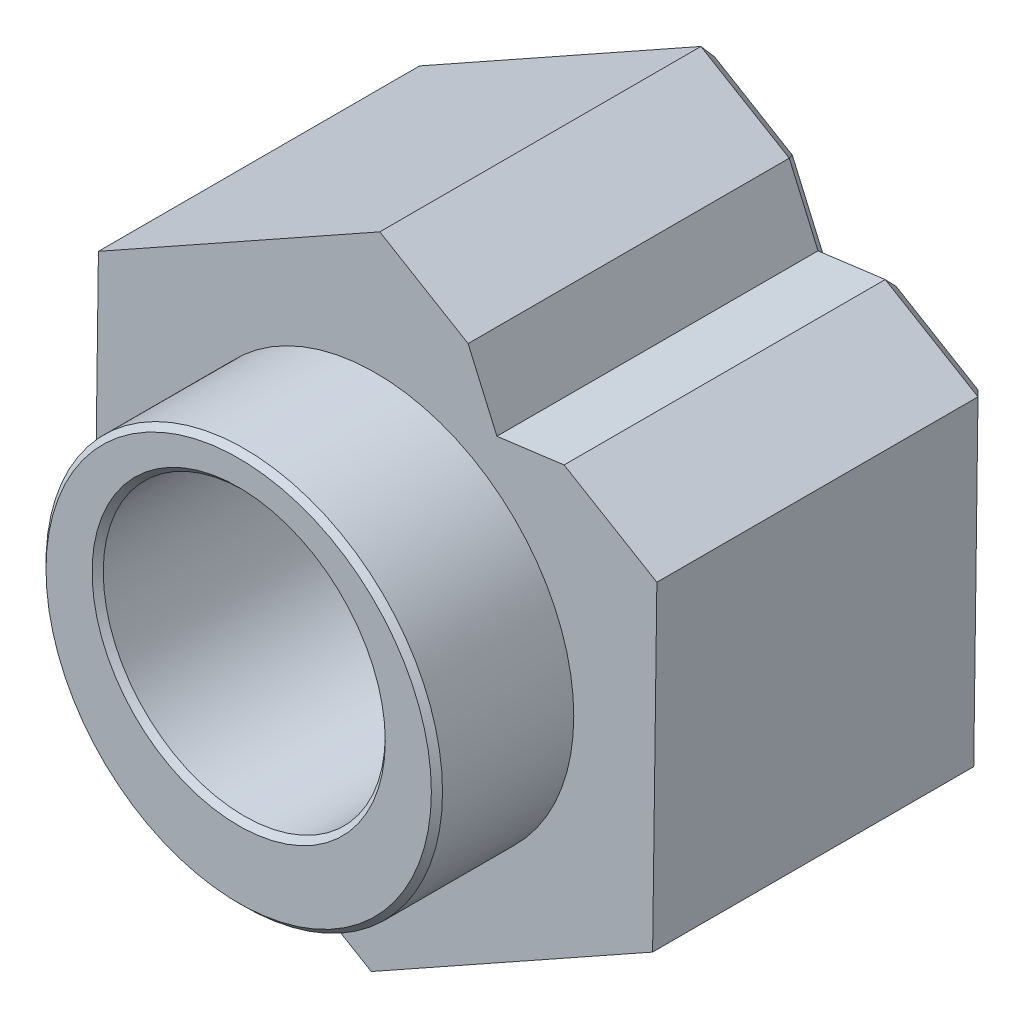
ISO-10303-21;
HEADER;
FILE_DESCRIPTION(('STEP AP214'),'2;1');
FILE_NAME('part.step','',(''),(''),'','','');
FILE_SCHEMA(('AUTOMOTIVE_DESIGN { 1 0 10303 214 1 1 1 1 }'));
ENDSEC;
DATA;
#1=APPLICATION_CONTEXT('core data for automotive mechanical design processes');
#2=APPLICATION_PROTOCOL_DEFINITION('international standard','automotive_design',2000,#1);
#3=PRODUCT_CONTEXT('',#1,'mechanical');
#4=PRODUCT('Part','Part','',(#3));
#5=PRODUCT_RELATED_PRODUCT_CATEGORY('part','',(#4));
#6=PRODUCT_DEFINITION_FORMATION('','',#4);
#7=PRODUCT_DEFINITION_CONTEXT('part definition',#1,'design');
#8=PRODUCT_DEFINITION('design','',#6,#7);
#9=PRODUCT_DEFINITION_SHAPE('','',#8);
#10=(LENGTH_UNIT() NAMED_UNIT(*) SI_UNIT(.MILLI.,.METRE.));
#11=(NAMED_UNIT(*) PLANE_ANGLE_UNIT() SI_UNIT($,.RADIAN.));
#12=(NAMED_UNIT(*) SI_UNIT($,.STERADIAN.) SOLID_ANGLE_UNIT());
#13=UNCERTAINTY_MEASURE_WITH_UNIT(LENGTH_MEASURE(1.E-05),#10,'distance_accuracy_value','');
#14=(GEOMETRIC_REPRESENTATION_CONTEXT(3) GLOBAL_UNCERTAINTY_ASSIGNED_CONTEXT((#13)) GLOBAL_UNIT_ASSIGNED_CONTEXT((#10,
#11,#12)) REPRESENTATION_CONTEXT('',''));
#15=CARTESIAN_POINT('',(0.,0.,0.));
#16=DIRECTION('',(0.,0.,1.));
#17=DIRECTION('',(1.,0.,0.));
#18=AXIS2_PLACEMENT_3D('',#15,#16,#17);
#19=CARTESIAN_POINT('',(5.03768639421828,2.82046966422999,6.));
#20=DIRECTION('',(-0.511393121150085,-0.859346889003721,0.));
#21=DIRECTION('',(0.859346889003721,-0.511393121150085,0.));
#22=AXIS2_PLACEMENT_3D('',#19,#20,#21);
#23=PLANE('',#22);
#24=DIRECTION('',(0.,0.,-1.));
#25=VECTOR('',#24,1.);
#26=CARTESIAN_POINT('',(1.65800995994404,4.83169854318089,8.45));
#27=LINE('',#26,#25);
#28=CARTESIAN_POINT('',(1.65800995994404,4.83169854318089,6.));
#29=VERTEX_POINT('',#28);
#30=CARTESIAN_POINT('',(1.65800995994404,4.83169854318089,0.250000000000004));
#31=VERTEX_POINT('',#30);
#32=EDGE_CURVE('E142',#29,#31,#27,.T.);
#33=ORIENTED_EDGE('',*,*,#32,.T.);
#34=DIRECTION('',(-0.859346889003721,0.511393121150085,0.));
#35=VECTOR('',#34,1.);
#36=CARTESIAN_POINT('',(5.03768639421828,2.82046966422999,0.250000000000004));
#37=LINE('',#36,#35);
#38=CARTESIAN_POINT('',(0.0762448172825978,5.77299922580725,0.250000000000004));
#39=VERTEX_POINT('',#38);
#40=EDGE_CURVE('E223',#31,#39,#37,.T.);
#41=ORIENTED_EDGE('',*,*,#40,.T.);
#42=DIRECTION('',(0.,0.,-1.));
#43=VECTOR('',#42,1.);
#44=CARTESIAN_POINT('',(0.0762448172825978,5.77299922580725,6.));
#45=LINE('',#44,#43);
#46=CARTESIAN_POINT('',(0.0762448172825978,5.77299922580725,6.));
#47=VERTEX_POINT('',#46);
#48=EDGE_CURVE('E178',#47,#39,#45,.T.);
#49=ORIENTED_EDGE('',*,*,#48,.F.);
#50=DIRECTION('',(-0.859346889003721,0.511393121150085,0.));
#51=VECTOR('',#50,1.);
#52=CARTESIAN_POINT('',(5.03768639421828,2.82046966422999,6.));
#53=LINE('',#52,#51);
#54=EDGE_CURVE('E159',#29,#47,#53,.T.);
#55=ORIENTED_EDGE('',*,*,#54,.F.);
#56=EDGE_LOOP('',(#33,#41,#49,#55));
#57=FACE_BOUND('',#56,.T.);
#58=ADVANCED_FACE('F34',(#57),#23,.F.);
#59=CARTESIAN_POINT('',(-0.0762448172825973,-5.77299922580725,6.));
#60=DIRECTION('',(-0.488519675965306,0.872552878738448,0.));
#61=DIRECTION('',(-0.872552878738448,-0.488519675965306,0.));
#62=AXIS2_PLACEMENT_3D('',#59,#60,#61);
#63=PLANE('',#62);
#64=DIRECTION('',(0.,0.,-1.));
#65=VECTOR('',#64,1.);
#66=CARTESIAN_POINT('',(-0.0762448172825973,-5.77299922580725,6.));
#67=LINE('',#66,#65);
#68=CARTESIAN_POINT('',(-0.0762448172825973,-5.77299922580725,6.));
#69=VERTEX_POINT('',#68);
#70=CARTESIAN_POINT('',(-0.0762448172825973,-5.77299922580725,0.250000000000004));
#71=VERTEX_POINT('',#70);
#72=EDGE_CURVE('E169',#69,#71,#67,.T.);
#73=ORIENTED_EDGE('',*,*,#72,.T.);
#74=DIRECTION('',(0.872552878738448,0.488519675965306,0.));
#75=VECTOR('',#74,1.);
#76=CARTESIAN_POINT('',(-0.0762448172825973,-5.77299922580725,0.250000000000004));
#77=LINE('',#76,#75);
#78=CARTESIAN_POINT('',(4.96144157693568,-2.95252956157726,0.250000000000004));
#79=VERTEX_POINT('',#78);
#80=EDGE_CURVE('E216',#71,#79,#77,.T.);
#81=ORIENTED_EDGE('',*,*,#80,.T.);
#82=DIRECTION('',(0.,0.,-1.));
#83=VECTOR('',#82,1.);
#84=CARTESIAN_POINT('',(4.96144157693568,-2.95252956157726,6.));
#85=LINE('',#84,#83);
#86=CARTESIAN_POINT('',(4.96144157693568,-2.95252956157726,6.));
#87=VERTEX_POINT('',#86);
#88=EDGE_CURVE('E183',#87,#79,#85,.T.);
#89=ORIENTED_EDGE('',*,*,#88,.F.);
#90=DIRECTION('',(0.872552878738448,0.488519675965306,0.));
#91=VECTOR('',#90,1.);
#92=CARTESIAN_POINT('',(-0.0762448172825973,-5.77299922580725,6.));
#93=LINE('',#92,#91);
#94=EDGE_CURVE('E369',#69,#87,#93,.T.);
#95=ORIENTED_EDGE('',*,*,#94,.F.);
#96=EDGE_LOOP('',(#73,#81,#89,#95));
#97=FACE_BOUND('',#96,.T.);
#98=ADVANCED_FACE('F300',(#97),#63,.F.);
#99=CARTESIAN_POINT('',(4.96144157693568,-2.95252956157726,6.));
#100=DIRECTION('',(-0.999912797115391,0.0132059897347263,0.));
#101=DIRECTION('',(-0.0132059897347263,-0.999912797115392,0.));
#102=AXIS2_PLACEMENT_3D('',#99,#100,#101);
#103=PLANE('',#102);
#104=ORIENTED_EDGE('',*,*,#88,.T.);
#105=DIRECTION('',(0.0132059897347263,0.999912797115392,0.));
#106=VECTOR('',#105,1.);
#107=CARTESIAN_POINT('',(4.96144157693568,-2.95252956157726,0.250000000000004));
#108=LINE('',#107,#106);
#109=CARTESIAN_POINT('',(5.03768639421828,2.82046966422999,0.250000000000004));
#110=VERTEX_POINT('',#109);
#111=EDGE_CURVE('E218',#79,#110,#108,.T.);
#112=ORIENTED_EDGE('',*,*,#111,.T.);
#113=DIRECTION('',(0.,0.,-1.));
#114=VECTOR('',#113,1.);
#115=CARTESIAN_POINT('',(5.03768639421828,2.82046966422999,6.));
#116=LINE('',#115,#114);
#117=CARTESIAN_POINT('',(5.03768639421828,2.82046966422999,6.));
#118=VERTEX_POINT('',#117);
#119=EDGE_CURVE('E181',#118,#110,#116,.T.);
#120=ORIENTED_EDGE('',*,*,#119,.F.);
#121=DIRECTION('',(0.0132059897347263,0.999912797115392,0.));
#122=VECTOR('',#121,1.);
#123=CARTESIAN_POINT('',(4.96144157693568,-2.95252956157726,6.));
#124=LINE('',#123,#122);
#125=EDGE_CURVE('E156',#87,#118,#124,.T.);
#126=ORIENTED_EDGE('',*,*,#125,.F.);
#127=EDGE_LOOP('',(#104,#112,#120,#126));
#128=FACE_BOUND('',#127,.T.);
#129=ADVANCED_FACE('F306',(#128),#103,.F.);
#130=ORIENTED_EDGE('',*,*,#119,.T.);
#131=DIRECTION('',(-0.859346889003721,0.511393121150085,0.));
#132=VECTOR('',#131,1.);
#133=CARTESIAN_POINT('',(5.03768639421828,2.82046966422999,0.250000000000004));
#134=LINE('',#133,#132);
#135=CARTESIAN_POINT('',(3.37670373795148,3.80891230088072,0.250000000000004));
#136=VERTEX_POINT('',#135);
#137=EDGE_CURVE('E150',#110,#136,#134,.T.);
#138=ORIENTED_EDGE('',*,*,#137,.T.);
#139=DIRECTION('',(0.,0.,-1.));
#140=VECTOR('',#139,1.);
#141=CARTESIAN_POINT('',(3.37670373795148,3.80891230088072,8.45));
#142=LINE('',#141,#140);
#143=CARTESIAN_POINT('',(3.37670373795148,3.80891230088072,6.));
#144=VERTEX_POINT('',#143);
#145=EDGE_CURVE('E135',#144,#136,#142,.T.);
#146=ORIENTED_EDGE('',*,*,#145,.F.);
#147=EDGE_CURVE('E148',#118,#144,#53,.T.);
#148=ORIENTED_EDGE('',*,*,#147,.F.);
#149=EDGE_LOOP('',(#130,#138,#146,#148));
#150=FACE_BOUND('',#149,.T.);
#151=ADVANCED_FACE('F147',(#150),#23,.F.);
#152=CARTESIAN_POINT('',(0.0762448172825978,5.77299922580725,6.));
#153=DIRECTION('',(0.488519675965306,-0.872552878738448,0.));
#154=DIRECTION('',(0.872552878738448,0.488519675965306,0.));
#155=AXIS2_PLACEMENT_3D('',#152,#153,#154);
#156=PLANE('',#155);
#157=ORIENTED_EDGE('',*,*,#48,.T.);
#158=DIRECTION('',(-0.872552878738448,-0.488519675965306,0.));
#159=VECTOR('',#158,1.);
#160=CARTESIAN_POINT('',(0.0762448172825978,5.77299922580725,0.250000000000004));
#161=LINE('',#160,#159);
#162=CARTESIAN_POINT('',(-4.96144157693568,2.95252956157726,0.250000000000004));
#163=VERTEX_POINT('',#162);
#164=EDGE_CURVE('E187',#39,#163,#161,.T.);
#165=ORIENTED_EDGE('',*,*,#164,.T.);
#166=DIRECTION('',(0.,0.,-1.));
#167=VECTOR('',#166,1.);
#168=CARTESIAN_POINT('',(-4.96144157693568,2.95252956157726,6.));
#169=LINE('',#168,#167);
#170=CARTESIAN_POINT('',(-4.96144157693568,2.95252956157726,6.));
#171=VERTEX_POINT('',#170);
#172=EDGE_CURVE('E175',#171,#163,#169,.T.);
#173=ORIENTED_EDGE('',*,*,#172,.F.);
#174=DIRECTION('',(-0.872552878738448,-0.488519675965306,0.));
#175=VECTOR('',#174,1.);
#176=CARTESIAN_POINT('',(0.0762448172825978,5.77299922580725,6.));
#177=LINE('',#176,#175);
#178=EDGE_CURVE('E158',#47,#171,#177,.T.);
#179=ORIENTED_EDGE('',*,*,#178,.F.);
#180=EDGE_LOOP('',(#157,#165,#173,#179));
#181=FACE_BOUND('',#180,.T.);
#182=ADVANCED_FACE('F312',(#181),#156,.F.);
#183=CARTESIAN_POINT('',(-4.96144157693568,2.95252956157726,6.));
#184=DIRECTION('',(0.999912797115391,-0.0132059897347262,0.));
#185=DIRECTION('',(0.0132059897347262,0.999912797115392,0.));
#186=AXIS2_PLACEMENT_3D('',#183,#184,#185);
#187=PLANE('',#186);
#188=ORIENTED_EDGE('',*,*,#172,.T.);
#189=DIRECTION('',(-0.0132059897347262,-0.999912797115392,0.));
#190=VECTOR('',#189,1.);
#191=CARTESIAN_POINT('',(-4.96144157693568,2.95252956157726,0.250000000000004));
#192=LINE('',#191,#190);
#193=CARTESIAN_POINT('',(-5.03768639421827,-2.82046966422999,0.250000000000004));
#194=VERTEX_POINT('',#193);
#195=EDGE_CURVE('E212',#163,#194,#192,.T.);
#196=ORIENTED_EDGE('',*,*,#195,.T.);
#197=DIRECTION('',(0.,0.,-1.));
#198=VECTOR('',#197,1.);
#199=CARTESIAN_POINT('',(-5.03768639421827,-2.82046966422999,6.));
#200=LINE('',#199,#198);
#201=CARTESIAN_POINT('',(-5.03768639421827,-2.82046966422999,6.));
#202=VERTEX_POINT('',#201);
#203=EDGE_CURVE('E172',#202,#194,#200,.T.);
#204=ORIENTED_EDGE('',*,*,#203,.F.);
#205=DIRECTION('',(-0.0132059897347262,-0.999912797115392,0.));
#206=VECTOR('',#205,1.);
#207=CARTESIAN_POINT('',(-4.96144157693568,2.95252956157726,6.));
#208=LINE('',#207,#206);
#209=EDGE_CURVE('E161',#171,#202,#208,.T.);
#210=ORIENTED_EDGE('',*,*,#209,.F.);
#211=EDGE_LOOP('',(#188,#196,#204,#210));
#212=FACE_BOUND('',#211,.T.);
#213=ADVANCED_FACE('F317',(#212),#187,.F.);
#214=CARTESIAN_POINT('',(-5.03768639421827,-2.82046966422999,6.));
#215=DIRECTION('',(0.511393121150085,0.859346889003721,0.));
#216=DIRECTION('',(-0.859346889003721,0.511393121150085,0.));
#217=AXIS2_PLACEMENT_3D('',#214,#215,#216);
#218=PLANE('',#217);
#219=ORIENTED_EDGE('',*,*,#203,.T.);
#220=DIRECTION('',(0.859346889003721,-0.511393121150085,0.));
#221=VECTOR('',#220,1.);
#222=CARTESIAN_POINT('',(-5.03768639421827,-2.82046966422999,0.250000000000004));
#223=LINE('',#222,#221);
#224=EDGE_CURVE('E214',#194,#71,#223,.T.);
#225=ORIENTED_EDGE('',*,*,#224,.T.);
#226=ORIENTED_EDGE('',*,*,#72,.F.);
#227=DIRECTION('',(0.859346889003721,-0.511393121150085,0.));
#228=VECTOR('',#227,1.);
#229=CARTESIAN_POINT('',(-5.03768639421827,-2.82046966422999,6.));
#230=LINE('',#229,#228);
#231=EDGE_CURVE('E167',#202,#69,#230,.T.);
#232=ORIENTED_EDGE('',*,*,#231,.F.);
#233=EDGE_LOOP('',(#219,#225,#226,#232));
#234=FACE_BOUND('',#233,.T.);
#235=ADVANCED_FACE('F376',(#234),#218,.F.);
#236=CARTESIAN_POINT('',(0.,0.,6.));
#237=DIRECTION('',(0.,0.,1.));
#238=DIRECTION('',(1.,0.,0.));
#239=AXIS2_PLACEMENT_3D('',#236,#237,#238);
#240=PLANE('',#239);
#241=DIRECTION('',(0.400421555458872,-0.916331041667747,0.));
#242=VECTOR('',#241,1.);
#243=CARTESIAN_POINT('',(3.16500947037353,1.38305694944312,6.));
#244=LINE('',#243,#242);
#245=CARTESIAN_POINT('',(2.17342076488787,3.65222427826583,6.));
#246=VERTEX_POINT('',#245);
#247=EDGE_CURVE('E141',#29,#246,#244,.T.);
#248=ORIENTED_EDGE('',*,*,#247,.F.);
#249=ORIENTED_EDGE('',*,*,#54,.T.);
#250=ORIENTED_EDGE('',*,*,#178,.T.);
#251=ORIENTED_EDGE('',*,*,#209,.T.);
#252=ORIENTED_EDGE('',*,*,#231,.T.);
#253=ORIENTED_EDGE('',*,*,#94,.T.);
#254=ORIENTED_EDGE('',*,*,#125,.T.);
#255=ORIENTED_EDGE('',*,*,#147,.T.);
#256=DIRECTION('',(0.991628072784241,0.129126934704627,0.));
#257=VECTOR('',#256,1.);
#258=CARTESIAN_POINT('',(-0.431413212970031,3.31303034436393,6.));
#259=LINE('',#258,#257);
#260=EDGE_CURVE('E132',#246,#144,#259,.T.);
#261=ORIENTED_EDGE('',*,*,#260,.F.);
#262=EDGE_LOOP('',(#248,#249,#250,#251,#252,#253,#254,#255,#261));
#263=FACE_BOUND('',#262,.T.);
#264=CARTESIAN_POINT('',(0.,0.,6.));
#265=DIRECTION('',(0.,0.,1.));
#266=DIRECTION('',(1.,0.,0.));
#267=AXIS2_PLACEMENT_3D('',#264,#265,#266);
#268=CIRCLE('',#267,3.55);
#269=CARTESIAN_POINT('',(3.55,0.,6.));
#270=VERTEX_POINT('',#269);
#271=EDGE_CURVE('E186',#270,#270,#268,.T.);
#272=ORIENTED_EDGE('',*,*,#271,.F.);
#273=EDGE_LOOP('',(#272));
#274=FACE_BOUND('',#273,.T.);
#275=ADVANCED_FACE('F153',(#263,#274),#240,.T.);
#276=CARTESIAN_POINT('',(0.,0.,0.));
#277=DIRECTION('',(0.,0.,1.));
#278=DIRECTION('',(1.,0.,0.));
#279=AXIS2_PLACEMENT_3D('',#276,#277,#278);
#280=PLANE('',#279);
#281=DIRECTION('',(0.0132059897347262,0.999912797115392,0.));
#282=VECTOR('',#281,1.);
#283=CARTESIAN_POINT('',(-4.74958578629813,0.0627284512399496,0.));
#284=LINE('',#283,#282);
#285=CARTESIAN_POINT('',(-4.78580207450736,-2.67944618101849,0.));
#286=VERTEX_POINT('',#285);
#287=CARTESIAN_POINT('',(-4.71336949808889,2.80490308349839,0.));
#288=VERTEX_POINT('',#287);
#289=EDGE_CURVE('E207',#286,#288,#284,.T.);
#290=ORIENTED_EDGE('',*,*,#289,.T.);
#291=DIRECTION('',(0.872552878738448,0.488519675965306,0.));
#292=VECTOR('',#291,1.);
#293=CARTESIAN_POINT('',(-2.32046846083521,4.14462617400764,0.));
#294=LINE('',#293,#292);
#295=CARTESIAN_POINT('',(0.0724325764184689,5.48434926451689,0.));
#296=VERTEX_POINT('',#295);
#297=EDGE_CURVE('E209',#288,#296,#294,.T.);
#298=ORIENTED_EDGE('',*,*,#297,.T.);
#299=DIRECTION('',(0.859346889003721,-0.511393121150085,0.));
#300=VECTOR('',#299,1.);
#301=CARTESIAN_POINT('',(2.42911732546291,4.08189772276769,0.));
#302=LINE('',#301,#300);
#303=CARTESIAN_POINT('',(1.4611049129614,4.65795716427575,0.));
#304=VERTEX_POINT('',#303);
#305=EDGE_CURVE('E193',#296,#304,#302,.T.);
#306=ORIENTED_EDGE('',*,*,#305,.T.);
#307=DIRECTION('',(0.400421555458872,-0.916331041667747,0.));
#308=VECTOR('',#307,1.);
#309=CARTESIAN_POINT('',(2.93592670995659,1.2829515605784,0.));
#310=LINE('',#309,#308);
#311=CARTESIAN_POINT('',(2.01951921578921,3.38007301239488,0.));
#312=VERTEX_POINT('',#311);
#313=EDGE_CURVE('E195',#304,#312,#310,.T.);
#314=ORIENTED_EDGE('',*,*,#313,.T.);
#315=DIRECTION('',(0.991628072784241,0.129126934704627,0.));
#316=VECTOR('',#315,1.);
#317=CARTESIAN_POINT('',(-0.399131479293873,3.06512332616786,0.));
#318=LINE('',#317,#316);
#319=CARTESIAN_POINT('',(3.32319856450041,3.54983436017938,0.));
#320=VERTEX_POINT('',#319);
#321=EDGE_CURVE('E197',#312,#320,#318,.T.);
#322=ORIENTED_EDGE('',*,*,#321,.T.);
#323=DIRECTION('',(0.859346889003721,-0.511393121150085,0.));
#324=VECTOR('',#323,1.);
#325=CARTESIAN_POINT('',(2.42911732546291,4.08189772276769,0.));
#326=LINE('',#325,#324);
#327=CARTESIAN_POINT('',(4.78580207450736,2.67944618101849,0.));
#328=VERTEX_POINT('',#327);
#329=EDGE_CURVE('E199',#320,#328,#326,.T.);
#330=ORIENTED_EDGE('',*,*,#329,.T.);
#331=DIRECTION('',(-0.0132059897347263,-0.999912797115392,0.));
#332=VECTOR('',#331,1.);
#333=CARTESIAN_POINT('',(4.74958578629813,-0.0627284512399503,0.));
#334=LINE('',#333,#332);
#335=CARTESIAN_POINT('',(4.71336949808889,-2.80490308349839,0.));
#336=VERTEX_POINT('',#335);
#337=EDGE_CURVE('E201',#328,#336,#334,.T.);
#338=ORIENTED_EDGE('',*,*,#337,.T.);
#339=DIRECTION('',(-0.872552878738448,-0.488519675965306,0.));
#340=VECTOR('',#339,1.);
#341=CARTESIAN_POINT('',(2.32046846083521,-4.14462617400764,0.));
#342=LINE('',#341,#340);
#343=CARTESIAN_POINT('',(-0.0724325764184675,-5.48434926451689,0.));
#344=VERTEX_POINT('',#343);
#345=EDGE_CURVE('E203',#336,#344,#342,.T.);
#346=ORIENTED_EDGE('',*,*,#345,.T.);
#347=DIRECTION('',(-0.859346889003721,0.511393121150085,0.));
#348=VECTOR('',#347,1.);
#349=CARTESIAN_POINT('',(-2.42911732546291,-4.08189772276769,0.));
#350=LINE('',#349,#348);
#351=EDGE_CURVE('E205',#344,#286,#350,.T.);
#352=ORIENTED_EDGE('',*,*,#351,.T.);
#353=EDGE_LOOP('',(#290,#298,#306,#314,#322,#330,#338,#346,#352));
#354=FACE_BOUND('',#353,.T.);
#355=CARTESIAN_POINT('',(0.,0.375,0.));
#356=DIRECTION('',(0.,0.,1.));
#357=DIRECTION('',(1.,0.,0.));
#358=AXIS2_PLACEMENT_3D('',#355,#356,#357);
#359=CIRCLE('',#358,2.775);
#360=CARTESIAN_POINT('',(2.775,0.375,0.));
#361=VERTEX_POINT('',#360);
#362=EDGE_CURVE('E190',#361,#361,#359,.T.);
#363=ORIENTED_EDGE('',*,*,#362,.T.);
#364=EDGE_LOOP('',(#363));
#365=FACE_BOUND('',#364,.T.);
#366=ADVANCED_FACE('F375',(#354,#365),#280,.F.);
#367=CARTESIAN_POINT('',(0.,0.,8.45));
#368=DIRECTION('',(0.,0.,-1.));
#369=DIRECTION('',(-1.,0.,0.));
#370=AXIS2_PLACEMENT_3D('',#367,#368,#369);
#371=CYLINDRICAL_SURFACE('',#370,3.55);
#372=CARTESIAN_POINT('',(0.,0.,8.35));
#373=DIRECTION('',(0.,0.,1.));
#374=DIRECTION('',(1.,0.,0.));
#375=AXIS2_PLACEMENT_3D('',#372,#373,#374);
#376=CIRCLE('',#375,3.55);
#377=CARTESIAN_POINT('',(3.55,0.,8.35));
#378=VERTEX_POINT('',#377);
#379=EDGE_CURVE('E42',#378,#378,#376,.F.);
#380=ORIENTED_EDGE('',*,*,#379,.T.);
#381=EDGE_LOOP('',(#380));
#382=FACE_BOUND('',#381,.T.);
#383=ORIENTED_EDGE('',*,*,#271,.T.);
#384=EDGE_LOOP('',(#383));
#385=FACE_BOUND('',#384,.T.);
#386=ADVANCED_FACE('F260',(#382,#385),#371,.T.);
#387=CARTESIAN_POINT('',(0.,0.,8.45));
#388=DIRECTION('',(0.,0.,1.));
#389=DIRECTION('',(1.,0.,0.));
#390=AXIS2_PLACEMENT_3D('',#387,#388,#389);
#391=PLANE('',#390);
#392=CARTESIAN_POINT('',(0.,0.,8.45));
#393=DIRECTION('',(0.,0.,1.));
#394=DIRECTION('',(1.,0.,0.));
#395=AXIS2_PLACEMENT_3D('',#392,#393,#394);
#396=CIRCLE('',#395,3.45);
#397=CARTESIAN_POINT('',(3.45,0.,8.45));
#398=VERTEX_POINT('',#397);
#399=EDGE_CURVE('E255',#398,#398,#396,.T.);
#400=ORIENTED_EDGE('',*,*,#399,.T.);
#401=EDGE_LOOP('',(#400));
#402=FACE_BOUND('',#401,.T.);
#403=CARTESIAN_POINT('',(0.,0.375,8.45));
#404=DIRECTION('',(0.,0.,1.));
#405=DIRECTION('',(1.,0.,0.));
#406=AXIS2_PLACEMENT_3D('',#403,#404,#405);
#407=CIRCLE('',#406,2.625);
#408=CARTESIAN_POINT('',(2.625,0.375,8.45));
#409=VERTEX_POINT('',#408);
#410=EDGE_CURVE('E228',#409,#409,#407,.F.);
#411=ORIENTED_EDGE('',*,*,#410,.T.);
#412=EDGE_LOOP('',(#411));
#413=FACE_BOUND('',#412,.T.);
#414=ADVANCED_FACE('F269',(#402,#413),#391,.T.);
#415=CARTESIAN_POINT('',(1.65800995994404,4.83169854318089,8.45));
#416=DIRECTION('',(-0.916331041667747,-0.400421555458872,0.));
#417=DIRECTION('',(0.400421555458872,-0.916331041667747,0.));
#418=AXIS2_PLACEMENT_3D('',#415,#416,#417);
#419=PLANE('',#418);
#420=DIRECTION('',(0.,0.,-1.));
#421=VECTOR('',#420,1.);
#422=CARTESIAN_POINT('',(2.17342076488787,3.65222427826583,8.45));
#423=LINE('',#422,#421);
#424=CARTESIAN_POINT('',(2.17342076488787,3.65222427826583,0.250000000000004));
#425=VERTEX_POINT('',#424);
#426=EDGE_CURVE('E137',#246,#425,#423,.T.);
#427=ORIENTED_EDGE('',*,*,#426,.T.);
#428=DIRECTION('',(-0.400421555458872,0.916331041667747,0.));
#429=VECTOR('',#428,1.);
#430=CARTESIAN_POINT('',(1.65800995994404,4.83169854318089,0.250000000000004));
#431=LINE('',#430,#429);
#432=EDGE_CURVE('E49',#425,#31,#431,.T.);
#433=ORIENTED_EDGE('',*,*,#432,.T.);
#434=ORIENTED_EDGE('',*,*,#32,.F.);
#435=ORIENTED_EDGE('',*,*,#247,.T.);
#436=EDGE_LOOP('',(#427,#433,#434,#435));
#437=FACE_BOUND('',#436,.T.);
#438=ADVANCED_FACE('F272',(#437),#419,.F.);
#439=CARTESIAN_POINT('',(2.17342076488787,3.65222427826583,8.45));
#440=DIRECTION('',(0.129126934704627,-0.991628072784241,0.));
#441=DIRECTION('',(0.991628072784241,0.129126934704627,0.));
#442=AXIS2_PLACEMENT_3D('',#439,#440,#441);
#443=PLANE('',#442);
#444=ORIENTED_EDGE('',*,*,#145,.T.);
#445=DIRECTION('',(-0.991628072784241,-0.129126934704627,0.));
#446=VECTOR('',#445,1.);
#447=CARTESIAN_POINT('',(2.17342076488787,3.65222427826583,0.250000000000004));
#448=LINE('',#447,#446);
#449=EDGE_CURVE('E57',#136,#425,#448,.T.);
#450=ORIENTED_EDGE('',*,*,#449,.T.);
#451=ORIENTED_EDGE('',*,*,#426,.F.);
#452=ORIENTED_EDGE('',*,*,#260,.T.);
#453=EDGE_LOOP('',(#444,#450,#451,#452));
#454=FACE_BOUND('',#453,.T.);
#455=ADVANCED_FACE('F134',(#454),#443,.F.);
#456=CARTESIAN_POINT('',(0.,0.375,-0.000999999999999265));
#457=DIRECTION('',(0.,0.,1.));
#458=DIRECTION('',(1.,0.,0.));
#459=AXIS2_PLACEMENT_3D('',#456,#457,#458);
#460=CYLINDRICAL_SURFACE('',#459,2.525);
#461=CARTESIAN_POINT('',(0.,0.375,8.35));
#462=DIRECTION('',(0.,0.,1.));
#463=DIRECTION('',(1.,0.,0.));
#464=AXIS2_PLACEMENT_3D('',#461,#462,#463);
#465=CIRCLE('',#464,2.525);
#466=CARTESIAN_POINT('',(2.525,0.375,8.35));
#467=VERTEX_POINT('',#466);
#468=EDGE_CURVE('E11',#467,#467,#465,.T.);
#469=ORIENTED_EDGE('',*,*,#468,.T.);
#470=EDGE_LOOP('',(#469));
#471=FACE_BOUND('',#470,.T.);
#472=CARTESIAN_POINT('',(0.,0.375,0.25));
#473=DIRECTION('',(0.,0.,1.));
#474=DIRECTION('',(1.,0.,0.));
#475=AXIS2_PLACEMENT_3D('',#472,#473,#474);
#476=CIRCLE('',#475,2.525);
#477=CARTESIAN_POINT('',(2.525,0.375,0.25));
#478=VERTEX_POINT('',#477);
#479=EDGE_CURVE('E225',#478,#478,#476,.F.);
#480=ORIENTED_EDGE('',*,*,#479,.T.);
#481=EDGE_LOOP('',(#480));
#482=FACE_BOUND('',#481,.T.);
#483=ADVANCED_FACE('F280',(#471,#482),#460,.F.);
#484=CARTESIAN_POINT('',(5.03768639421828,2.82046966422999,0.250000000000004));
#485=DIRECTION('',(-0.361609543817379,-0.607650012606095,0.707106781186547));
#486=DIRECTION('',(-0.859346889003721,0.511393121150085,0.));
#487=AXIS2_PLACEMENT_3D('',#484,#485,#486);
#488=PLANE('',#487);
#489=DIRECTION('',(-0.146998790167371,-0.711784326369543,-0.686843816616256));
#490=VECTOR('',#489,1.);
#491=CARTESIAN_POINT('',(3.33430793155358,3.60362713857795,0.0519079106590021));
#492=LINE('',#491,#490);
#493=EDGE_CURVE('E248',#136,#320,#492,.T.);
#494=ORIENTED_EDGE('',*,*,#493,.F.);
#495=ORIENTED_EDGE('',*,*,#137,.F.);
#496=DIRECTION('',(-0.659587977970124,-0.369286163761729,-0.654653670707977));
#497=VECTOR('',#496,1.);
#498=CARTESIAN_POINT('',(5.03768639421828,2.82046966422999,0.250000000000004));
#499=LINE('',#498,#497);
#500=EDGE_CURVE('E151',#328,#110,#499,.F.);
#501=ORIENTED_EDGE('',*,*,#500,.F.);
#502=ORIENTED_EDGE('',*,*,#329,.F.);
#503=EDGE_LOOP('',(#494,#495,#501,#502));
#504=FACE_BOUND('',#503,.T.);
#505=ADVANCED_FACE('F283',(#504),#488,.F.);
#506=CARTESIAN_POINT('',(4.96144157693568,-2.95252956157726,0.250000000000004));
#507=DIRECTION('',(-0.707045119435502,0.00933804489370492,0.707106781186548));
#508=DIRECTION('',(0.0132059897347263,0.999912797115392,0.));
#509=AXIS2_PLACEMENT_3D('',#506,#507,#508);
#510=PLANE('',#509);
#511=ORIENTED_EDGE('',*,*,#500,.T.);
#512=ORIENTED_EDGE('',*,*,#111,.F.);
#513=DIRECTION('',(-0.649605188068821,0.386576863072073,-0.654653670707977));
#514=VECTOR('',#513,1.);
#515=CARTESIAN_POINT('',(4.96144157693568,-2.95252956157726,0.250000000000004));
#516=LINE('',#515,#514);
#517=EDGE_CURVE('E245',#336,#79,#516,.F.);
#518=ORIENTED_EDGE('',*,*,#517,.F.);
#519=ORIENTED_EDGE('',*,*,#337,.F.);
#520=EDGE_LOOP('',(#511,#512,#518,#519));
#521=FACE_BOUND('',#520,.T.);
#522=ADVANCED_FACE('F345',(#521),#510,.F.);
#523=CARTESIAN_POINT('',(2.17342076488787,3.65222427826583,0.250000000000004));
#524=DIRECTION('',(0.0913065311634741,-0.701186934680683,0.707106781186549));
#525=DIRECTION('',(-0.991628072784241,-0.129126934704627,0.));
#526=AXIS2_PLACEMENT_3D('',#523,#524,#525);
#527=PLANE('',#526);
#528=ORIENTED_EDGE('',*,*,#493,.T.);
#529=ORIENTED_EDGE('',*,*,#321,.F.);
#530=DIRECTION('',(-0.384451238517068,-0.679843002496381,-0.62450839638823));
#531=VECTOR('',#530,1.);
#532=CARTESIAN_POINT('',(2.17342076488787,3.65222427826583,0.250000000000004));
#533=LINE('',#532,#531);
#534=EDGE_CURVE('E242',#425,#312,#533,.T.);
#535=ORIENTED_EDGE('',*,*,#534,.F.);
#536=ORIENTED_EDGE('',*,*,#449,.F.);
#537=EDGE_LOOP('',(#528,#529,#535,#536));
#538=FACE_BOUND('',#537,.T.);
#539=ADVANCED_FACE('F341',(#538),#527,.F.);
#540=CARTESIAN_POINT('',(-0.0762448172825973,-5.77299922580725,0.250000000000004));
#541=DIRECTION('',(-0.345435575618122,0.616988057499799,0.707106781186548));
#542=DIRECTION('',(0.872552878738448,0.488519675965306,0.));
#543=AXIS2_PLACEMENT_3D('',#540,#541,#542);
#544=PLANE('',#543);
#545=ORIENTED_EDGE('',*,*,#517,.T.);
#546=ORIENTED_EDGE('',*,*,#80,.F.);
#547=DIRECTION('',(0.00998278990130284,0.755863026833804,-0.654653670707976));
#548=VECTOR('',#547,1.);
#549=CARTESIAN_POINT('',(-0.0762448172825976,-5.77299922580725,0.250000000000004));
#550=LINE('',#549,#548);
#551=EDGE_CURVE('E239',#344,#71,#550,.F.);
#552=ORIENTED_EDGE('',*,*,#551,.F.);
#553=ORIENTED_EDGE('',*,*,#345,.F.);
#554=EDGE_LOOP('',(#545,#546,#552,#553));
#555=FACE_BOUND('',#554,.T.);
#556=ADVANCED_FACE('F337',(#555),#544,.F.);
#557=CARTESIAN_POINT('',(1.65800995994404,4.83169854318089,0.250000000000004));
#558=DIRECTION('',(-0.647943893374996,-0.283140797198233,0.707106781186548));
#559=DIRECTION('',(-0.400421555458872,0.916331041667747,0.));
#560=AXIS2_PLACEMENT_3D('',#557,#558,#559);
#561=PLANE('',#560);
#562=ORIENTED_EDGE('',*,*,#534,.T.);
#563=ORIENTED_EDGE('',*,*,#313,.F.);
#564=DIRECTION('',(-0.543080103592555,-0.479192826694958,-0.689520294063921));
#565=VECTOR('',#564,1.);
#566=CARTESIAN_POINT('',(2.1313958207137,5.24939587224716,0.851033173125582));
#567=LINE('',#566,#565);
#568=EDGE_CURVE('E236',#31,#304,#567,.T.);
#569=ORIENTED_EDGE('',*,*,#568,.F.);
#570=ORIENTED_EDGE('',*,*,#432,.F.);
#571=EDGE_LOOP('',(#562,#563,#569,#570));
#572=FACE_BOUND('',#571,.T.);
#573=ADVANCED_FACE('F333',(#572),#561,.F.);
#574=CARTESIAN_POINT('',(-5.03768639421827,-2.82046966422999,0.250000000000004));
#575=DIRECTION('',(0.361609543817378,0.607650012606094,0.707106781186549));
#576=DIRECTION('',(0.859346889003721,-0.511393121150085,0.));
#577=AXIS2_PLACEMENT_3D('',#574,#575,#576);
#578=PLANE('',#577);
#579=ORIENTED_EDGE('',*,*,#551,.T.);
#580=ORIENTED_EDGE('',*,*,#224,.F.);
#581=DIRECTION('',(0.659587977970122,0.369286163761734,-0.654653670707977));
#582=VECTOR('',#581,1.);
#583=CARTESIAN_POINT('',(-5.03768639421827,-2.82046966422999,0.250000000000004));
#584=LINE('',#583,#582);
#585=EDGE_CURVE('E233',#286,#194,#584,.F.);
#586=ORIENTED_EDGE('',*,*,#585,.F.);
#587=ORIENTED_EDGE('',*,*,#351,.F.);
#588=EDGE_LOOP('',(#579,#580,#586,#587));
#589=FACE_BOUND('',#588,.T.);
#590=ADVANCED_FACE('F329',(#589),#578,.F.);
#591=CARTESIAN_POINT('',(5.03768639421828,2.82046966422999,0.250000000000004));
#592=DIRECTION('',(-0.361609543817379,-0.607650012606095,0.707106781186547));
#593=DIRECTION('',(-0.859346889003721,0.511393121150085,0.));
#594=AXIS2_PLACEMENT_3D('',#591,#592,#593);
#595=PLANE('',#594);
#596=ORIENTED_EDGE('',*,*,#568,.T.);
#597=ORIENTED_EDGE('',*,*,#305,.F.);
#598=DIRECTION('',(0.00998278990129953,0.755863026833803,0.654653670707977));
#599=VECTOR('',#598,1.);
#600=CARTESIAN_POINT('',(0.0544605837732911,4.1235708755766,-1.17857142857144));
#601=LINE('',#600,#599);
#602=EDGE_CURVE('E231',#39,#296,#601,.F.);
#603=ORIENTED_EDGE('',*,*,#602,.F.);
#604=ORIENTED_EDGE('',*,*,#40,.F.);
#605=EDGE_LOOP('',(#596,#597,#603,#604));
#606=FACE_BOUND('',#605,.T.);
#607=ADVANCED_FACE('F325',(#606),#595,.F.);
#608=CARTESIAN_POINT('',(-4.96144157693568,2.95252956157726,0.250000000000004));
#609=DIRECTION('',(0.707045119435502,-0.00933804489370482,0.707106781186547));
#610=DIRECTION('',(-0.0132059897347262,-0.999912797115392,0.));
#611=AXIS2_PLACEMENT_3D('',#608,#609,#610);
#612=PLANE('',#611);
#613=ORIENTED_EDGE('',*,*,#585,.T.);
#614=ORIENTED_EDGE('',*,*,#195,.F.);
#615=DIRECTION('',(0.64960518806882,-0.386576863072074,-0.654653670707977));
#616=VECTOR('',#615,1.);
#617=CARTESIAN_POINT('',(-4.96144157693568,2.95252956157726,0.250000000000004));
#618=LINE('',#617,#616);
#619=EDGE_CURVE('E229',#288,#163,#618,.F.);
#620=ORIENTED_EDGE('',*,*,#619,.F.);
#621=ORIENTED_EDGE('',*,*,#289,.F.);
#622=EDGE_LOOP('',(#613,#614,#620,#621));
#623=FACE_BOUND('',#622,.T.);
#624=ADVANCED_FACE('F294',(#623),#612,.F.);
#625=CARTESIAN_POINT('',(0.0762448172825978,5.77299922580725,0.250000000000004));
#626=DIRECTION('',(0.345435575618122,-0.616988057499799,0.707106781186548));
#627=DIRECTION('',(-0.872552878738448,-0.488519675965306,0.));
#628=AXIS2_PLACEMENT_3D('',#625,#626,#627);
#629=PLANE('',#628);
#630=ORIENTED_EDGE('',*,*,#602,.T.);
#631=ORIENTED_EDGE('',*,*,#297,.F.);
#632=ORIENTED_EDGE('',*,*,#619,.T.);
#633=ORIENTED_EDGE('',*,*,#164,.F.);
#634=EDGE_LOOP('',(#630,#631,#632,#633));
#635=FACE_BOUND('',#634,.T.);
#636=ADVANCED_FACE('F288',(#635),#629,.F.);
#637=CARTESIAN_POINT('',(0.,0.375,0.25));
#638=DIRECTION('',(0.,0.,-1.));
#639=DIRECTION('',(-1.,0.,0.));
#640=AXIS2_PLACEMENT_3D('',#637,#638,#639);
#641=CONICAL_SURFACE('',#640,2.525,0.785398163397455);
#642=ORIENTED_EDGE('',*,*,#362,.F.);
#643=EDGE_LOOP('',(#642));
#644=FACE_BOUND('',#643,.T.);
#645=ORIENTED_EDGE('',*,*,#479,.F.);
#646=EDGE_LOOP('',(#645));
#647=FACE_BOUND('',#646,.T.);
#648=ADVANCED_FACE('F266',(#644,#647),#641,.F.);
#649=CARTESIAN_POINT('',(0.,0.,8.45));
#650=DIRECTION('',(0.,0.,-1.));
#651=DIRECTION('',(-1.,0.,0.));
#652=AXIS2_PLACEMENT_3D('',#649,#650,#651);
#653=CONICAL_SURFACE('',#652,3.45,0.78539816339745);
#654=ORIENTED_EDGE('',*,*,#379,.F.);
#655=EDGE_LOOP('',(#654));
#656=FACE_BOUND('',#655,.T.);
#657=ORIENTED_EDGE('',*,*,#399,.F.);
#658=EDGE_LOOP('',(#657));
#659=FACE_BOUND('',#658,.T.);
#660=ADVANCED_FACE('F263',(#656,#659),#653,.T.);
#661=CARTESIAN_POINT('',(0.,0.375,8.35));
#662=DIRECTION('',(0.,0.,1.));
#663=DIRECTION('',(1.,0.,0.));
#664=AXIS2_PLACEMENT_3D('',#661,#662,#663);
#665=CONICAL_SURFACE('',#664,2.525,0.785398163397446);
#666=ORIENTED_EDGE('',*,*,#410,.F.);
#667=EDGE_LOOP('',(#666));
#668=FACE_BOUND('',#667,.T.);
#669=ORIENTED_EDGE('',*,*,#468,.F.);
#670=EDGE_LOOP('',(#669));
#671=FACE_BOUND('',#670,.T.);
#672=ADVANCED_FACE('F36',(#668,#671),#665,.F.);
#673=CLOSED_SHELL('',(#58,#98,#129,#151,#182,#213,#235,#275,#366,#386,#414,#438,#455,#483,#505,
#522,#539,#556,#573,#590,#607,#624,#636,#648,#660,#672));
#674=MANIFOLD_SOLID_BREP('B2',#673);
#675=ADVANCED_BREP_SHAPE_REPRESENTATION('',(#18,#674),#14);
#676=SHAPE_DEFINITION_REPRESENTATION(#9,#675);
ENDSEC;
END-ISO-10303-21;
